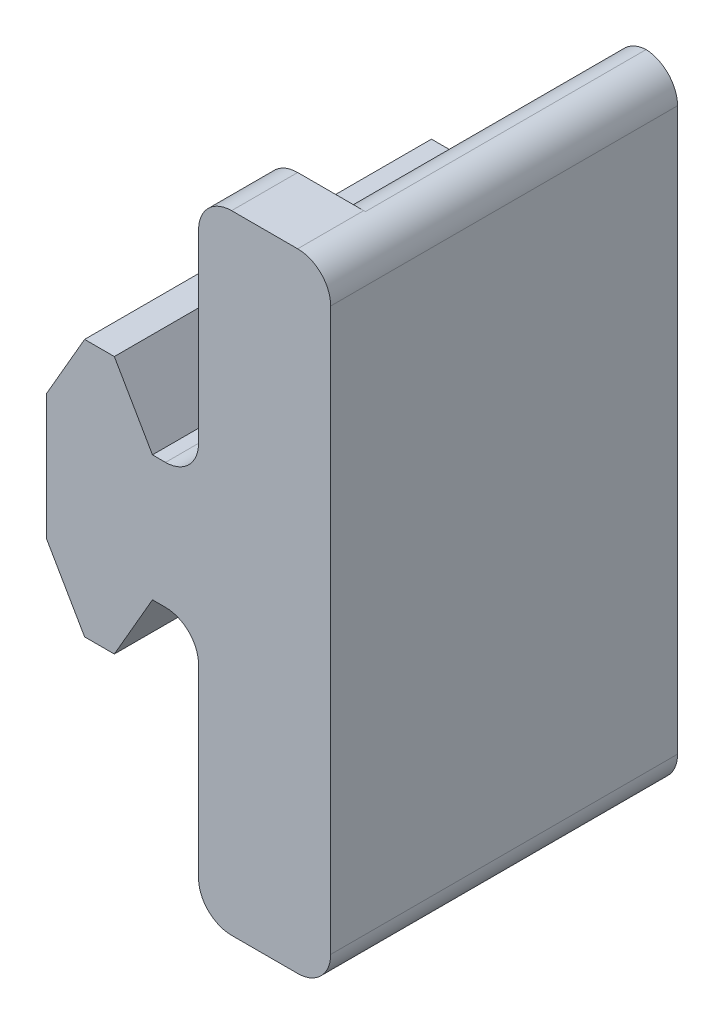
ISO-10303-21;
HEADER;
FILE_DESCRIPTION(('STEP AP214'),'2;1');
FILE_NAME('part.step','',(''),(''),'','','');
FILE_SCHEMA(('AUTOMOTIVE_DESIGN { 1 0 10303 214 1 1 1 1 }'));
ENDSEC;
DATA;
#1=APPLICATION_CONTEXT('core data for automotive mechanical design processes');
#2=APPLICATION_PROTOCOL_DEFINITION('international standard','automotive_design',2000,#1);
#3=PRODUCT_CONTEXT('',#1,'mechanical');
#4=PRODUCT('Part','Part','',(#3));
#5=PRODUCT_RELATED_PRODUCT_CATEGORY('part','',(#4));
#6=PRODUCT_DEFINITION_FORMATION('','',#4);
#7=PRODUCT_DEFINITION_CONTEXT('part definition',#1,'design');
#8=PRODUCT_DEFINITION('design','',#6,#7);
#9=PRODUCT_DEFINITION_SHAPE('','',#8);
#10=(LENGTH_UNIT() NAMED_UNIT(*) SI_UNIT(.MILLI.,.METRE.));
#11=(NAMED_UNIT(*) PLANE_ANGLE_UNIT() SI_UNIT($,.RADIAN.));
#12=(NAMED_UNIT(*) SI_UNIT($,.STERADIAN.) SOLID_ANGLE_UNIT());
#13=UNCERTAINTY_MEASURE_WITH_UNIT(LENGTH_MEASURE(1.E-05),#10,'distance_accuracy_value','');
#14=(GEOMETRIC_REPRESENTATION_CONTEXT(3) GLOBAL_UNCERTAINTY_ASSIGNED_CONTEXT((#13)) GLOBAL_UNIT_ASSIGNED_CONTEXT((#10,
#11,#12)) REPRESENTATION_CONTEXT('',''));
#15=CARTESIAN_POINT('',(0.,0.,0.));
#16=DIRECTION('',(0.,0.,1.));
#17=DIRECTION('',(1.,0.,0.));
#18=AXIS2_PLACEMENT_3D('',#15,#16,#17);
#19=CARTESIAN_POINT('',(0.,-3.8,21.));
#20=DIRECTION('',(1.,0.,0.));
#21=DIRECTION('',(0.,0.,-1.));
#22=AXIS2_PLACEMENT_3D('',#19,#20,#21);
#23=PLANE('',#22);
#24=DIRECTION('',(0.,-1.,0.));
#25=VECTOR('',#24,1.);
#26=CARTESIAN_POINT('',(0.,-3.8,21.));
#27=LINE('',#26,#25);
#28=CARTESIAN_POINT('',(0.,-5.8,21.));
#29=VERTEX_POINT('',#28);
#30=CARTESIAN_POINT('',(0.,-17.,21.));
#31=VERTEX_POINT('',#30);
#32=EDGE_CURVE('E393',#29,#31,#27,.T.);
#33=ORIENTED_EDGE('',*,*,#32,.F.);
#34=DIRECTION('',(0.,0.,-1.));
#35=VECTOR('',#34,1.);
#36=CARTESIAN_POINT('',(0.,-5.8,17.));
#37=LINE('',#36,#35);
#38=CARTESIAN_POINT('',(0.,-5.8,17.));
#39=VERTEX_POINT('',#38);
#40=EDGE_CURVE('E314',#29,#39,#37,.T.);
#41=ORIENTED_EDGE('',*,*,#40,.T.);
#42=DIRECTION('',(0.,1.,0.));
#43=VECTOR('',#42,1.);
#44=CARTESIAN_POINT('',(0.,-19.,17.));
#45=LINE('',#44,#43);
#46=CARTESIAN_POINT('',(0.,-17.,17.));
#47=VERTEX_POINT('',#46);
#48=EDGE_CURVE('E457',#47,#39,#45,.T.);
#49=ORIENTED_EDGE('',*,*,#48,.F.);
#50=DIRECTION('',(0.,0.,-1.));
#51=VECTOR('',#50,1.);
#52=CARTESIAN_POINT('',(0.,-17.,21.));
#53=LINE('',#52,#51);
#54=EDGE_CURVE('E312',#47,#31,#53,.F.);
#55=ORIENTED_EDGE('',*,*,#54,.T.);
#56=EDGE_LOOP('',(#33,#41,#49,#55));
#57=FACE_BOUND('',#56,.T.);
#58=ADVANCED_FACE('F39',(#57),#23,.F.);
#59=CARTESIAN_POINT('',(0.,3.8,21.));
#60=DIRECTION('',(1.,0.,0.));
#61=DIRECTION('',(0.,0.,-1.));
#62=AXIS2_PLACEMENT_3D('',#59,#60,#61);
#63=PLANE('',#62);
#64=CARTESIAN_POINT('',(0.,5.8,17.));
#65=VERTEX_POINT('',#64);
#66=CARTESIAN_POINT('',(0.,17.,17.));
#67=VERTEX_POINT('',#66);
#68=EDGE_CURVE('E353',#65,#67,#45,.T.);
#69=ORIENTED_EDGE('',*,*,#68,.F.);
#70=DIRECTION('',(0.,0.,-1.));
#71=VECTOR('',#70,1.);
#72=CARTESIAN_POINT('',(0.,5.8,21.));
#73=LINE('',#72,#71);
#74=CARTESIAN_POINT('',(0.,5.8,21.));
#75=VERTEX_POINT('',#74);
#76=EDGE_CURVE('E328',#65,#75,#73,.F.);
#77=ORIENTED_EDGE('',*,*,#76,.T.);
#78=DIRECTION('',(0.,-1.,0.));
#79=VECTOR('',#78,1.);
#80=CARTESIAN_POINT('',(0.,3.8,21.));
#81=LINE('',#80,#79);
#82=CARTESIAN_POINT('',(0.,17.,21.));
#83=VERTEX_POINT('',#82);
#84=EDGE_CURVE('E405',#83,#75,#81,.T.);
#85=ORIENTED_EDGE('',*,*,#84,.F.);
#86=DIRECTION('',(0.,0.,-1.));
#87=VECTOR('',#86,1.);
#88=CARTESIAN_POINT('',(0.,17.,21.));
#89=LINE('',#88,#87);
#90=EDGE_CURVE('E325',#83,#67,#89,.T.);
#91=ORIENTED_EDGE('',*,*,#90,.T.);
#92=EDGE_LOOP('',(#69,#77,#85,#91));
#93=FACE_BOUND('',#92,.T.);
#94=ADVANCED_FACE('F475',(#93),#63,.F.);
#95=CARTESIAN_POINT('',(0.,0.,0.));
#96=DIRECTION('',(0.,0.,-1.));
#97=DIRECTION('',(-1.,0.,0.));
#98=AXIS2_PLACEMENT_3D('',#95,#96,#97);
#99=PLANE('',#98);
#100=DIRECTION('',(0.,1.,0.));
#101=VECTOR('',#100,1.);
#102=CARTESIAN_POINT('',(0.,0.,0.));
#103=LINE('',#102,#101);
#104=CARTESIAN_POINT('',(0.,-3.8,0.));
#105=VERTEX_POINT('',#104);
#106=CARTESIAN_POINT('',(0.,3.8,0.));
#107=VERTEX_POINT('',#106);
#108=EDGE_CURVE('E217',#105,#107,#103,.T.);
#109=ORIENTED_EDGE('',*,*,#108,.F.);
#110=DIRECTION('',(1.,0.,0.));
#111=VECTOR('',#110,1.);
#112=CARTESIAN_POINT('',(-2.79059892324151,-3.8,0.));
#113=LINE('',#112,#111);
#114=CARTESIAN_POINT('',(-2.79059892324151,-3.8,0.));
#115=VERTEX_POINT('',#114);
#116=EDGE_CURVE('E230',#115,#105,#113,.T.);
#117=ORIENTED_EDGE('',*,*,#116,.F.);
#118=DIRECTION('',(0.499999999999998,0.86602540378444,0.));
#119=VECTOR('',#118,1.);
#120=CARTESIAN_POINT('',(-5.1,-7.8,0.));
#121=LINE('',#120,#119);
#122=CARTESIAN_POINT('',(-5.1,-7.8,0.));
#123=VERTEX_POINT('',#122);
#124=EDGE_CURVE('E242',#123,#115,#121,.T.);
#125=ORIENTED_EDGE('',*,*,#124,.F.);
#126=DIRECTION('',(1.,0.,0.));
#127=VECTOR('',#126,1.);
#128=CARTESIAN_POINT('',(-6.9,-7.8,0.));
#129=LINE('',#128,#127);
#130=CARTESIAN_POINT('',(-6.9,-7.8,0.));
#131=VERTEX_POINT('',#130);
#132=EDGE_CURVE('E246',#131,#123,#129,.T.);
#133=ORIENTED_EDGE('',*,*,#132,.F.);
#134=DIRECTION('',(0.499999999999998,-0.86602540378444,0.));
#135=VECTOR('',#134,1.);
#136=CARTESIAN_POINT('',(-9.20940107675849,-3.8,0.));
#137=LINE('',#136,#135);
#138=CARTESIAN_POINT('',(-9.20940107675849,-3.8,0.));
#139=VERTEX_POINT('',#138);
#140=EDGE_CURVE('E417',#139,#131,#137,.T.);
#141=ORIENTED_EDGE('',*,*,#140,.F.);
#142=DIRECTION('',(0.,-1.,0.));
#143=VECTOR('',#142,1.);
#144=CARTESIAN_POINT('',(-9.20940107675849,-3.8,0.));
#145=LINE('',#144,#143);
#146=CARTESIAN_POINT('',(-9.20940107675849,3.8,0.));
#147=VERTEX_POINT('',#146);
#148=EDGE_CURVE('E415',#147,#139,#145,.T.);
#149=ORIENTED_EDGE('',*,*,#148,.F.);
#150=DIRECTION('',(-0.499999999999998,-0.86602540378444,0.));
#151=VECTOR('',#150,1.);
#152=CARTESIAN_POINT('',(-9.20940107675849,3.8,0.));
#153=LINE('',#152,#151);
#154=CARTESIAN_POINT('',(-6.9,7.8,0.));
#155=VERTEX_POINT('',#154);
#156=EDGE_CURVE('E222',#155,#147,#153,.T.);
#157=ORIENTED_EDGE('',*,*,#156,.F.);
#158=DIRECTION('',(-1.,0.,0.));
#159=VECTOR('',#158,1.);
#160=CARTESIAN_POINT('',(-6.9,7.8,0.));
#161=LINE('',#160,#159);
#162=CARTESIAN_POINT('',(-5.1,7.8,0.));
#163=VERTEX_POINT('',#162);
#164=EDGE_CURVE('E253',#163,#155,#161,.T.);
#165=ORIENTED_EDGE('',*,*,#164,.F.);
#166=DIRECTION('',(-0.499999999999998,0.86602540378444,0.));
#167=VECTOR('',#166,1.);
#168=CARTESIAN_POINT('',(-5.1,7.8,0.));
#169=LINE('',#168,#167);
#170=CARTESIAN_POINT('',(-2.79059892324151,3.8,0.));
#171=VERTEX_POINT('',#170);
#172=EDGE_CURVE('E251',#171,#163,#169,.T.);
#173=ORIENTED_EDGE('',*,*,#172,.F.);
#174=DIRECTION('',(-1.,0.,0.));
#175=VECTOR('',#174,1.);
#176=CARTESIAN_POINT('',(-2.79059892324151,3.8,0.));
#177=LINE('',#176,#175);
#178=EDGE_CURVE('E232',#107,#171,#177,.T.);
#179=ORIENTED_EDGE('',*,*,#178,.F.);
#180=EDGE_LOOP('',(#109,#117,#125,#133,#141,#149,#157,#165,#173,#179));
#181=FACE_BOUND('',#180,.T.);
#182=ADVANCED_FACE('F228',(#181),#99,.T.);
#183=CARTESIAN_POINT('',(-9.20940107675849,3.8,21.));
#184=DIRECTION('',(0.86602540378444,-0.499999999999998,0.));
#185=DIRECTION('',(0.499999999999998,0.86602540378444,0.));
#186=AXIS2_PLACEMENT_3D('',#183,#184,#185);
#187=PLANE('',#186);
#188=ORIENTED_EDGE('',*,*,#156,.T.);
#189=DIRECTION('',(0.,0.,-1.));
#190=VECTOR('',#189,1.);
#191=CARTESIAN_POINT('',(-9.20940107675849,3.8,21.));
#192=LINE('',#191,#190);
#193=CARTESIAN_POINT('',(-9.20940107675849,3.8,21.));
#194=VERTEX_POINT('',#193);
#195=EDGE_CURVE('E234',#194,#147,#192,.T.);
#196=ORIENTED_EDGE('',*,*,#195,.F.);
#197=DIRECTION('',(-0.499999999999998,-0.86602540378444,0.));
#198=VECTOR('',#197,1.);
#199=CARTESIAN_POINT('',(-9.20940107675849,3.8,21.));
#200=LINE('',#199,#198);
#201=CARTESIAN_POINT('',(-6.9,7.8,21.));
#202=VERTEX_POINT('',#201);
#203=EDGE_CURVE('E255',#202,#194,#200,.T.);
#204=ORIENTED_EDGE('',*,*,#203,.F.);
#205=DIRECTION('',(0.,0.,-1.));
#206=VECTOR('',#205,1.);
#207=CARTESIAN_POINT('',(-6.9,7.8,21.));
#208=LINE('',#207,#206);
#209=EDGE_CURVE('E256',#202,#155,#208,.T.);
#210=ORIENTED_EDGE('',*,*,#209,.T.);
#211=EDGE_LOOP('',(#188,#196,#204,#210));
#212=FACE_BOUND('',#211,.T.);
#213=ADVANCED_FACE('F442',(#212),#187,.F.);
#214=CARTESIAN_POINT('',(-9.20940107675849,-3.8,21.));
#215=DIRECTION('',(1.,0.,0.));
#216=DIRECTION('',(0.,0.,-1.));
#217=AXIS2_PLACEMENT_3D('',#214,#215,#216);
#218=PLANE('',#217);
#219=ORIENTED_EDGE('',*,*,#148,.T.);
#220=DIRECTION('',(0.,0.,-1.));
#221=VECTOR('',#220,1.);
#222=CARTESIAN_POINT('',(-9.20940107675849,-3.8,21.));
#223=LINE('',#222,#221);
#224=CARTESIAN_POINT('',(-9.20940107675849,-3.8,21.));
#225=VERTEX_POINT('',#224);
#226=EDGE_CURVE('E273',#225,#139,#223,.T.);
#227=ORIENTED_EDGE('',*,*,#226,.F.);
#228=DIRECTION('',(0.,-1.,0.));
#229=VECTOR('',#228,1.);
#230=CARTESIAN_POINT('',(-9.20940107675849,-3.8,21.));
#231=LINE('',#230,#229);
#232=EDGE_CURVE('E382',#194,#225,#231,.T.);
#233=ORIENTED_EDGE('',*,*,#232,.F.);
#234=ORIENTED_EDGE('',*,*,#195,.T.);
#235=EDGE_LOOP('',(#219,#227,#233,#234));
#236=FACE_BOUND('',#235,.T.);
#237=ADVANCED_FACE('F439',(#236),#218,.F.);
#238=CARTESIAN_POINT('',(-9.20940107675849,-3.8,21.));
#239=DIRECTION('',(0.86602540378444,0.499999999999998,0.));
#240=DIRECTION('',(-0.499999999999998,0.86602540378444,0.));
#241=AXIS2_PLACEMENT_3D('',#238,#239,#240);
#242=PLANE('',#241);
#243=ORIENTED_EDGE('',*,*,#140,.T.);
#244=DIRECTION('',(0.,0.,-1.));
#245=VECTOR('',#244,1.);
#246=CARTESIAN_POINT('',(-6.9,-7.8,21.));
#247=LINE('',#246,#245);
#248=CARTESIAN_POINT('',(-6.9,-7.8,21.));
#249=VERTEX_POINT('',#248);
#250=EDGE_CURVE('E270',#249,#131,#247,.T.);
#251=ORIENTED_EDGE('',*,*,#250,.F.);
#252=DIRECTION('',(0.499999999999998,-0.86602540378444,0.));
#253=VECTOR('',#252,1.);
#254=CARTESIAN_POINT('',(-9.20940107675849,-3.8,21.));
#255=LINE('',#254,#253);
#256=EDGE_CURVE('E384',#225,#249,#255,.T.);
#257=ORIENTED_EDGE('',*,*,#256,.F.);
#258=ORIENTED_EDGE('',*,*,#226,.T.);
#259=EDGE_LOOP('',(#243,#251,#257,#258));
#260=FACE_BOUND('',#259,.T.);
#261=ADVANCED_FACE('F434',(#260),#242,.F.);
#262=CARTESIAN_POINT('',(-6.9,-7.8,21.));
#263=DIRECTION('',(0.,1.,0.));
#264=DIRECTION('',(0.,0.,1.));
#265=AXIS2_PLACEMENT_3D('',#262,#263,#264);
#266=PLANE('',#265);
#267=ORIENTED_EDGE('',*,*,#132,.T.);
#268=DIRECTION('',(0.,0.,-1.));
#269=VECTOR('',#268,1.);
#270=CARTESIAN_POINT('',(-5.1,-7.8,21.));
#271=LINE('',#270,#269);
#272=CARTESIAN_POINT('',(-5.1,-7.8,21.));
#273=VERTEX_POINT('',#272);
#274=EDGE_CURVE('E267',#273,#123,#271,.T.);
#275=ORIENTED_EDGE('',*,*,#274,.F.);
#276=DIRECTION('',(1.,0.,0.));
#277=VECTOR('',#276,1.);
#278=CARTESIAN_POINT('',(-6.9,-7.8,21.));
#279=LINE('',#278,#277);
#280=EDGE_CURVE('E386',#249,#273,#279,.T.);
#281=ORIENTED_EDGE('',*,*,#280,.F.);
#282=ORIENTED_EDGE('',*,*,#250,.T.);
#283=EDGE_LOOP('',(#267,#275,#281,#282));
#284=FACE_BOUND('',#283,.T.);
#285=ADVANCED_FACE('F421',(#284),#266,.F.);
#286=CARTESIAN_POINT('',(-5.1,-7.8,21.));
#287=DIRECTION('',(-0.86602540378444,0.499999999999998,0.));
#288=DIRECTION('',(-0.499999999999998,-0.86602540378444,0.));
#289=AXIS2_PLACEMENT_3D('',#286,#287,#288);
#290=PLANE('',#289);
#291=ORIENTED_EDGE('',*,*,#124,.T.);
#292=DIRECTION('',(0.,0.,-1.));
#293=VECTOR('',#292,1.);
#294=CARTESIAN_POINT('',(-2.79059892324151,-3.8,21.));
#295=LINE('',#294,#293);
#296=CARTESIAN_POINT('',(-2.79059892324151,-3.8,21.));
#297=VERTEX_POINT('',#296);
#298=EDGE_CURVE('E240',#297,#115,#295,.T.);
#299=ORIENTED_EDGE('',*,*,#298,.F.);
#300=DIRECTION('',(0.499999999999998,0.86602540378444,0.));
#301=VECTOR('',#300,1.);
#302=CARTESIAN_POINT('',(-5.1,-7.8,21.));
#303=LINE('',#302,#301);
#304=EDGE_CURVE('E388',#273,#297,#303,.T.);
#305=ORIENTED_EDGE('',*,*,#304,.F.);
#306=ORIENTED_EDGE('',*,*,#274,.T.);
#307=EDGE_LOOP('',(#291,#299,#305,#306));
#308=FACE_BOUND('',#307,.T.);
#309=ADVANCED_FACE('F427',(#308),#290,.F.);
#310=CARTESIAN_POINT('',(-2.79059892324151,-3.8,21.));
#311=DIRECTION('',(0.,1.,0.));
#312=DIRECTION('',(-1.,0.,0.));
#313=AXIS2_PLACEMENT_3D('',#310,#311,#312);
#314=PLANE('',#313);
#315=DIRECTION('',(0.,0.,1.));
#316=VECTOR('',#315,1.);
#317=CARTESIAN_POINT('',(0.,-3.8,21.));
#318=LINE('',#317,#316);
#319=CARTESIAN_POINT('',(0.,-3.8,17.));
#320=VERTEX_POINT('',#319);
#321=EDGE_CURVE('E213',#105,#320,#318,.T.);
#322=ORIENTED_EDGE('',*,*,#321,.T.);
#323=DIRECTION('',(-1.,0.,0.));
#324=VECTOR('',#323,1.);
#325=CARTESIAN_POINT('',(-2.79059892324151,-3.8,17.));
#326=LINE('',#325,#324);
#327=CARTESIAN_POINT('',(-2.,-3.8,17.));
#328=VERTEX_POINT('',#327);
#329=EDGE_CURVE('E56',#320,#328,#326,.T.);
#330=ORIENTED_EDGE('',*,*,#329,.T.);
#331=DIRECTION('',(0.,0.,-1.));
#332=VECTOR('',#331,1.);
#333=CARTESIAN_POINT('',(-2.,-3.8,21.));
#334=LINE('',#333,#332);
#335=CARTESIAN_POINT('',(-2.,-3.8,21.));
#336=VERTEX_POINT('',#335);
#337=EDGE_CURVE('E317',#328,#336,#334,.F.);
#338=ORIENTED_EDGE('',*,*,#337,.T.);
#339=DIRECTION('',(1.,0.,0.));
#340=VECTOR('',#339,1.);
#341=CARTESIAN_POINT('',(-2.79059892324151,-3.8,21.));
#342=LINE('',#341,#340);
#343=EDGE_CURVE('E390',#297,#336,#342,.T.);
#344=ORIENTED_EDGE('',*,*,#343,.F.);
#345=ORIENTED_EDGE('',*,*,#298,.T.);
#346=ORIENTED_EDGE('',*,*,#116,.T.);
#347=EDGE_LOOP('',(#322,#330,#338,#344,#345,#346));
#348=FACE_BOUND('',#347,.T.);
#349=ADVANCED_FACE('F237',(#348),#314,.F.);
#350=CARTESIAN_POINT('',(0.,-19.,21.));
#351=DIRECTION('',(0.,1.,0.));
#352=DIRECTION('',(0.,0.,1.));
#353=AXIS2_PLACEMENT_3D('',#350,#351,#352);
#354=PLANE('',#353);
#355=DIRECTION('',(-1.,0.,0.));
#356=VECTOR('',#355,1.);
#357=CARTESIAN_POINT('',(0.,-19.,17.));
#358=LINE('',#357,#356);
#359=CARTESIAN_POINT('',(6.,-19.,17.));
#360=VERTEX_POINT('',#359);
#361=CARTESIAN_POINT('',(2.,-19.,17.));
#362=VERTEX_POINT('',#361);
#363=EDGE_CURVE('E369',#360,#362,#358,.T.);
#364=ORIENTED_EDGE('',*,*,#363,.F.);
#365=DIRECTION('',(0.,0.,-1.));
#366=VECTOR('',#365,1.);
#367=CARTESIAN_POINT('',(6.,-19.,21.));
#368=LINE('',#367,#366);
#369=CARTESIAN_POINT('',(6.,-19.,21.));
#370=VERTEX_POINT('',#369);
#371=EDGE_CURVE('E310',#360,#370,#368,.F.);
#372=ORIENTED_EDGE('',*,*,#371,.T.);
#373=DIRECTION('',(1.,0.,0.));
#374=VECTOR('',#373,1.);
#375=CARTESIAN_POINT('',(0.,-19.,21.));
#376=LINE('',#375,#374);
#377=CARTESIAN_POINT('',(2.,-19.,21.));
#378=VERTEX_POINT('',#377);
#379=EDGE_CURVE('E396',#378,#370,#376,.T.);
#380=ORIENTED_EDGE('',*,*,#379,.F.);
#381=DIRECTION('',(0.,0.,-1.));
#382=VECTOR('',#381,1.);
#383=CARTESIAN_POINT('',(2.,-19.,21.));
#384=LINE('',#383,#382);
#385=EDGE_CURVE('E307',#378,#362,#384,.T.);
#386=ORIENTED_EDGE('',*,*,#385,.T.);
#387=EDGE_LOOP('',(#364,#372,#380,#386));
#388=FACE_BOUND('',#387,.T.);
#389=ADVANCED_FACE('F502',(#388),#354,.F.);
#390=CARTESIAN_POINT('',(8.,19.,21.));
#391=DIRECTION('',(-1.,0.,0.));
#392=DIRECTION('',(0.,0.,1.));
#393=AXIS2_PLACEMENT_3D('',#390,#391,#392);
#394=PLANE('',#393);
#395=DIRECTION('',(0.,1.,0.));
#396=VECTOR('',#395,1.);
#397=CARTESIAN_POINT('',(8.,19.,0.));
#398=LINE('',#397,#396);
#399=CARTESIAN_POINT('',(8.,-17.,0.));
#400=VERTEX_POINT('',#399);
#401=CARTESIAN_POINT('',(8.,17.,0.));
#402=VERTEX_POINT('',#401);
#403=EDGE_CURVE('E241',#400,#402,#398,.T.);
#404=ORIENTED_EDGE('',*,*,#403,.T.);
#405=DIRECTION('',(0.,0.,-1.));
#406=VECTOR('',#405,1.);
#407=CARTESIAN_POINT('',(8.,17.,21.));
#408=LINE('',#407,#406);
#409=CARTESIAN_POINT('',(8.,17.,21.));
#410=VERTEX_POINT('',#409);
#411=EDGE_CURVE('E292',#402,#410,#408,.F.);
#412=ORIENTED_EDGE('',*,*,#411,.T.);
#413=DIRECTION('',(0.,1.,0.));
#414=VECTOR('',#413,1.);
#415=CARTESIAN_POINT('',(8.,19.,21.));
#416=LINE('',#415,#414);
#417=CARTESIAN_POINT('',(8.,-17.,21.));
#418=VERTEX_POINT('',#417);
#419=EDGE_CURVE('E399',#418,#410,#416,.T.);
#420=ORIENTED_EDGE('',*,*,#419,.F.);
#421=DIRECTION('',(0.,0.,-1.));
#422=VECTOR('',#421,1.);
#423=CARTESIAN_POINT('',(8.,-17.,21.));
#424=LINE('',#423,#422);
#425=EDGE_CURVE('E290',#418,#400,#424,.T.);
#426=ORIENTED_EDGE('',*,*,#425,.T.);
#427=EDGE_LOOP('',(#404,#412,#420,#426));
#428=FACE_BOUND('',#427,.T.);
#429=ADVANCED_FACE('F652',(#428),#394,.F.);
#430=CARTESIAN_POINT('',(0.,19.,21.));
#431=DIRECTION('',(0.,-1.,0.));
#432=DIRECTION('',(0.,0.,-1.));
#433=AXIS2_PLACEMENT_3D('',#430,#431,#432);
#434=PLANE('',#433);
#435=DIRECTION('',(-1.,0.,0.));
#436=VECTOR('',#435,1.);
#437=CARTESIAN_POINT('',(0.,19.,21.));
#438=LINE('',#437,#436);
#439=CARTESIAN_POINT('',(6.,19.,21.));
#440=VERTEX_POINT('',#439);
#441=CARTESIAN_POINT('',(2.,19.,21.));
#442=VERTEX_POINT('',#441);
#443=EDGE_CURVE('E402',#440,#442,#438,.T.);
#444=ORIENTED_EDGE('',*,*,#443,.F.);
#445=DIRECTION('',(0.,0.,-1.));
#446=VECTOR('',#445,1.);
#447=CARTESIAN_POINT('',(6.,19.,21.));
#448=LINE('',#447,#446);
#449=CARTESIAN_POINT('',(6.,19.,17.));
#450=VERTEX_POINT('',#449);
#451=EDGE_CURVE('E279',#440,#450,#448,.T.);
#452=ORIENTED_EDGE('',*,*,#451,.T.);
#453=DIRECTION('',(1.,0.,0.));
#454=VECTOR('',#453,1.);
#455=CARTESIAN_POINT('',(0.,19.,17.));
#456=LINE('',#455,#454);
#457=CARTESIAN_POINT('',(2.,19.,17.));
#458=VERTEX_POINT('',#457);
#459=EDGE_CURVE('E376',#458,#450,#456,.T.);
#460=ORIENTED_EDGE('',*,*,#459,.F.);
#461=DIRECTION('',(0.,0.,-1.));
#462=VECTOR('',#461,1.);
#463=CARTESIAN_POINT('',(2.,19.,21.));
#464=LINE('',#463,#462);
#465=EDGE_CURVE('E233',#458,#442,#464,.F.);
#466=ORIENTED_EDGE('',*,*,#465,.T.);
#467=EDGE_LOOP('',(#444,#452,#460,#466));
#468=FACE_BOUND('',#467,.T.);
#469=ADVANCED_FACE('F468',(#468),#434,.F.);
#470=CARTESIAN_POINT('',(-2.79059892324151,3.8,21.));
#471=DIRECTION('',(0.,-1.,0.));
#472=DIRECTION('',(1.,0.,0.));
#473=AXIS2_PLACEMENT_3D('',#470,#471,#472);
#474=PLANE('',#473);
#475=DIRECTION('',(-1.,0.,0.));
#476=VECTOR('',#475,1.);
#477=CARTESIAN_POINT('',(-2.79059892324151,3.8,21.));
#478=LINE('',#477,#476);
#479=CARTESIAN_POINT('',(-2.,3.8,21.));
#480=VERTEX_POINT('',#479);
#481=CARTESIAN_POINT('',(-2.79059892324151,3.8,21.));
#482=VERTEX_POINT('',#481);
#483=EDGE_CURVE('E408',#480,#482,#478,.T.);
#484=ORIENTED_EDGE('',*,*,#483,.F.);
#485=DIRECTION('',(0.,0.,-1.));
#486=VECTOR('',#485,1.);
#487=CARTESIAN_POINT('',(-2.,3.8,17.));
#488=LINE('',#487,#486);
#489=CARTESIAN_POINT('',(-2.,3.8,17.));
#490=VERTEX_POINT('',#489);
#491=EDGE_CURVE('E322',#480,#490,#488,.T.);
#492=ORIENTED_EDGE('',*,*,#491,.T.);
#493=DIRECTION('',(1.,0.,0.));
#494=VECTOR('',#493,1.);
#495=CARTESIAN_POINT('',(-2.79059892324151,3.8,17.));
#496=LINE('',#495,#494);
#497=CARTESIAN_POINT('',(0.,3.8,17.));
#498=VERTEX_POINT('',#497);
#499=EDGE_CURVE('E320',#490,#498,#496,.T.);
#500=ORIENTED_EDGE('',*,*,#499,.T.);
#501=DIRECTION('',(0.,0.,-1.));
#502=VECTOR('',#501,1.);
#503=CARTESIAN_POINT('',(0.,3.8,21.));
#504=LINE('',#503,#502);
#505=EDGE_CURVE('E223',#498,#107,#504,.T.);
#506=ORIENTED_EDGE('',*,*,#505,.T.);
#507=ORIENTED_EDGE('',*,*,#178,.T.);
#508=DIRECTION('',(0.,0.,-1.));
#509=VECTOR('',#508,1.);
#510=CARTESIAN_POINT('',(-2.79059892324151,3.8,21.));
#511=LINE('',#510,#509);
#512=EDGE_CURVE('E263',#482,#171,#511,.T.);
#513=ORIENTED_EDGE('',*,*,#512,.F.);
#514=EDGE_LOOP('',(#484,#492,#500,#506,#507,#513));
#515=FACE_BOUND('',#514,.T.);
#516=ADVANCED_FACE('F454',(#515),#474,.F.);
#517=CARTESIAN_POINT('',(-5.1,7.8,21.));
#518=DIRECTION('',(-0.86602540378444,-0.499999999999998,0.));
#519=DIRECTION('',(0.499999999999998,-0.86602540378444,0.));
#520=AXIS2_PLACEMENT_3D('',#517,#518,#519);
#521=PLANE('',#520);
#522=ORIENTED_EDGE('',*,*,#172,.T.);
#523=DIRECTION('',(0.,0.,-1.));
#524=VECTOR('',#523,1.);
#525=CARTESIAN_POINT('',(-5.1,7.8,21.));
#526=LINE('',#525,#524);
#527=CARTESIAN_POINT('',(-5.1,7.8,21.));
#528=VERTEX_POINT('',#527);
#529=EDGE_CURVE('E259',#528,#163,#526,.T.);
#530=ORIENTED_EDGE('',*,*,#529,.F.);
#531=DIRECTION('',(-0.499999999999998,0.86602540378444,0.));
#532=VECTOR('',#531,1.);
#533=CARTESIAN_POINT('',(-5.1,7.8,21.));
#534=LINE('',#533,#532);
#535=EDGE_CURVE('E410',#482,#528,#534,.T.);
#536=ORIENTED_EDGE('',*,*,#535,.F.);
#537=ORIENTED_EDGE('',*,*,#512,.T.);
#538=EDGE_LOOP('',(#522,#530,#536,#537));
#539=FACE_BOUND('',#538,.T.);
#540=ADVANCED_FACE('F449',(#539),#521,.F.);
#541=CARTESIAN_POINT('',(-6.9,7.8,21.));
#542=DIRECTION('',(0.,-1.,0.));
#543=DIRECTION('',(0.,0.,-1.));
#544=AXIS2_PLACEMENT_3D('',#541,#542,#543);
#545=PLANE('',#544);
#546=ORIENTED_EDGE('',*,*,#164,.T.);
#547=ORIENTED_EDGE('',*,*,#209,.F.);
#548=DIRECTION('',(-1.,0.,0.));
#549=VECTOR('',#548,1.);
#550=CARTESIAN_POINT('',(-6.9,7.8,21.));
#551=LINE('',#550,#549);
#552=EDGE_CURVE('E260',#528,#202,#551,.T.);
#553=ORIENTED_EDGE('',*,*,#552,.F.);
#554=ORIENTED_EDGE('',*,*,#529,.T.);
#555=EDGE_LOOP('',(#546,#547,#553,#554));
#556=FACE_BOUND('',#555,.T.);
#557=ADVANCED_FACE('F446',(#556),#545,.F.);
#558=CARTESIAN_POINT('',(0.,0.,21.));
#559=DIRECTION('',(0.,0.,-1.));
#560=DIRECTION('',(-1.,0.,0.));
#561=AXIS2_PLACEMENT_3D('',#558,#559,#560);
#562=PLANE('',#561);
#563=ORIENTED_EDGE('',*,*,#419,.T.);
#564=CARTESIAN_POINT('',(6.,17.,21.));
#565=DIRECTION('',(0.,0.,-1.));
#566=DIRECTION('',(-1.,0.,0.));
#567=AXIS2_PLACEMENT_3D('',#564,#565,#566);
#568=CIRCLE('',#567,2.);
#569=EDGE_CURVE('E300',#410,#440,#568,.F.);
#570=ORIENTED_EDGE('',*,*,#569,.T.);
#571=ORIENTED_EDGE('',*,*,#443,.T.);
#572=CARTESIAN_POINT('',(2.,17.,21.));
#573=DIRECTION('',(0.,0.,-1.));
#574=DIRECTION('',(-1.,0.,0.));
#575=AXIS2_PLACEMENT_3D('',#572,#573,#574);
#576=CIRCLE('',#575,2.);
#577=EDGE_CURVE('E294',#442,#83,#576,.F.);
#578=ORIENTED_EDGE('',*,*,#577,.T.);
#579=ORIENTED_EDGE('',*,*,#84,.T.);
#580=CARTESIAN_POINT('',(-2.,5.8,21.));
#581=DIRECTION('',(0.,0.,-1.));
#582=DIRECTION('',(-1.,0.,0.));
#583=AXIS2_PLACEMENT_3D('',#580,#581,#582);
#584=CIRCLE('',#583,2.);
#585=EDGE_CURVE('E48',#75,#480,#584,.T.);
#586=ORIENTED_EDGE('',*,*,#585,.T.);
#587=ORIENTED_EDGE('',*,*,#483,.T.);
#588=ORIENTED_EDGE('',*,*,#535,.T.);
#589=ORIENTED_EDGE('',*,*,#552,.T.);
#590=ORIENTED_EDGE('',*,*,#203,.T.);
#591=ORIENTED_EDGE('',*,*,#232,.T.);
#592=ORIENTED_EDGE('',*,*,#256,.T.);
#593=ORIENTED_EDGE('',*,*,#280,.T.);
#594=ORIENTED_EDGE('',*,*,#304,.T.);
#595=ORIENTED_EDGE('',*,*,#343,.T.);
#596=CARTESIAN_POINT('',(-2.,-5.8,21.));
#597=DIRECTION('',(0.,0.,-1.));
#598=DIRECTION('',(-1.,0.,0.));
#599=AXIS2_PLACEMENT_3D('',#596,#597,#598);
#600=CIRCLE('',#599,2.);
#601=EDGE_CURVE('E341',#336,#29,#600,.T.);
#602=ORIENTED_EDGE('',*,*,#601,.T.);
#603=ORIENTED_EDGE('',*,*,#32,.T.);
#604=CARTESIAN_POINT('',(2.,-17.,21.));
#605=DIRECTION('',(0.,0.,-1.));
#606=DIRECTION('',(-1.,0.,0.));
#607=AXIS2_PLACEMENT_3D('',#604,#605,#606);
#608=CIRCLE('',#607,2.);
#609=EDGE_CURVE('E296',#31,#378,#608,.F.);
#610=ORIENTED_EDGE('',*,*,#609,.T.);
#611=ORIENTED_EDGE('',*,*,#379,.T.);
#612=CARTESIAN_POINT('',(6.,-17.,21.));
#613=DIRECTION('',(0.,0.,-1.));
#614=DIRECTION('',(-1.,0.,0.));
#615=AXIS2_PLACEMENT_3D('',#612,#613,#614);
#616=CIRCLE('',#615,2.);
#617=EDGE_CURVE('E298',#370,#418,#616,.F.);
#618=ORIENTED_EDGE('',*,*,#617,.T.);
#619=EDGE_LOOP('',(#563,#570,#571,#578,#579,#586,#587,#588,#589,#590,#591,#592,#593,#594,#595,
#602,#603,#610,#611,#618));
#620=FACE_BOUND('',#619,.T.);
#621=ADVANCED_FACE('F429',(#620),#562,.F.);
#622=CARTESIAN_POINT('',(6.,-17.,0.));
#623=DIRECTION('',(0.,0.,-1.));
#624=DIRECTION('',(-1.,0.,0.));
#625=AXIS2_PLACEMENT_3D('',#622,#623,#624);
#626=CIRCLE('',#625,2.);
#627=CARTESIAN_POINT('',(6.09999999999997,-18.9974984355438,0.));
#628=VERTEX_POINT('',#627);
#629=EDGE_CURVE('E286',#400,#628,#626,.T.);
#630=ORIENTED_EDGE('',*,*,#629,.T.);
#631=CARTESIAN_POINT('',(6.2,-17.,0.));
#632=DIRECTION('',(0.,0.,-1.));
#633=DIRECTION('',(-1.,0.,0.));
#634=AXIS2_PLACEMENT_3D('',#631,#632,#633);
#635=CIRCLE('',#634,2.);
#636=CARTESIAN_POINT('',(4.2,-17.,0.));
#637=VERTEX_POINT('',#636);
#638=EDGE_CURVE('E288',#628,#637,#635,.T.);
#639=ORIENTED_EDGE('',*,*,#638,.T.);
#640=DIRECTION('',(0.,-1.,0.));
#641=VECTOR('',#640,1.);
#642=CARTESIAN_POINT('',(4.2,-19.,0.));
#643=LINE('',#642,#641);
#644=CARTESIAN_POINT('',(4.2,17.,0.));
#645=VERTEX_POINT('',#644);
#646=EDGE_CURVE('E347',#645,#637,#643,.T.);
#647=ORIENTED_EDGE('',*,*,#646,.F.);
#648=CARTESIAN_POINT('',(6.2,17.,0.));
#649=DIRECTION('',(0.,0.,-1.));
#650=DIRECTION('',(-1.,0.,0.));
#651=AXIS2_PLACEMENT_3D('',#648,#649,#650);
#652=CIRCLE('',#651,2.);
#653=CARTESIAN_POINT('',(6.09999999999997,18.9974984355438,0.));
#654=VERTEX_POINT('',#653);
#655=EDGE_CURVE('E282',#645,#654,#652,.T.);
#656=ORIENTED_EDGE('',*,*,#655,.T.);
#657=CARTESIAN_POINT('',(6.,17.,0.));
#658=DIRECTION('',(0.,0.,-1.));
#659=DIRECTION('',(-1.,0.,0.));
#660=AXIS2_PLACEMENT_3D('',#657,#658,#659);
#661=CIRCLE('',#660,2.);
#662=EDGE_CURVE('E284',#654,#402,#661,.T.);
#663=ORIENTED_EDGE('',*,*,#662,.T.);
#664=ORIENTED_EDGE('',*,*,#403,.F.);
#665=EDGE_LOOP('',(#630,#639,#647,#656,#663,#664));
#666=FACE_BOUND('',#665,.T.);
#667=ADVANCED_FACE('F590',(#666),#99,.T.);
#668=CARTESIAN_POINT('',(0.,-19.,17.));
#669=DIRECTION('',(-1.,0.,0.));
#670=DIRECTION('',(0.,0.,1.));
#671=AXIS2_PLACEMENT_3D('',#668,#669,#670);
#672=PLANE('',#671);
#673=ORIENTED_EDGE('',*,*,#108,.T.);
#674=ORIENTED_EDGE('',*,*,#505,.F.);
#675=EDGE_CURVE('E219',#320,#498,#45,.T.);
#676=ORIENTED_EDGE('',*,*,#675,.F.);
#677=ORIENTED_EDGE('',*,*,#321,.F.);
#678=EDGE_LOOP('',(#673,#674,#676,#677));
#679=FACE_BOUND('',#678,.T.);
#680=ADVANCED_FACE('F215',(#679),#672,.F.);
#681=CARTESIAN_POINT('',(4.2,-19.,17.));
#682=DIRECTION('',(1.,0.,0.));
#683=DIRECTION('',(0.,1.,0.));
#684=AXIS2_PLACEMENT_3D('',#681,#682,#683);
#685=PLANE('',#684);
#686=ORIENTED_EDGE('',*,*,#646,.T.);
#687=DIRECTION('',(0.,0.,-1.));
#688=VECTOR('',#687,1.);
#689=CARTESIAN_POINT('',(4.2,-17.,17.));
#690=LINE('',#689,#688);
#691=CARTESIAN_POINT('',(4.2,-17.,17.));
#692=VERTEX_POINT('',#691);
#693=EDGE_CURVE('E304',#637,#692,#690,.F.);
#694=ORIENTED_EDGE('',*,*,#693,.T.);
#695=DIRECTION('',(0.,-1.,0.));
#696=VECTOR('',#695,1.);
#697=CARTESIAN_POINT('',(4.2,-19.,17.));
#698=LINE('',#697,#696);
#699=CARTESIAN_POINT('',(4.2,17.,17.));
#700=VERTEX_POINT('',#699);
#701=EDGE_CURVE('E373',#700,#692,#698,.T.);
#702=ORIENTED_EDGE('',*,*,#701,.F.);
#703=DIRECTION('',(0.,0.,-1.));
#704=VECTOR('',#703,1.);
#705=CARTESIAN_POINT('',(4.2,17.,17.));
#706=LINE('',#705,#704);
#707=EDGE_CURVE('E302',#700,#645,#706,.T.);
#708=ORIENTED_EDGE('',*,*,#707,.T.);
#709=EDGE_LOOP('',(#686,#694,#702,#708));
#710=FACE_BOUND('',#709,.T.);
#711=ADVANCED_FACE('F576',(#710),#685,.F.);
#712=CARTESIAN_POINT('',(0.,0.,17.));
#713=DIRECTION('',(0.,0.,-1.));
#714=DIRECTION('',(-1.,0.,0.));
#715=AXIS2_PLACEMENT_3D('',#712,#713,#714);
#716=PLANE('',#715);
#717=ORIENTED_EDGE('',*,*,#363,.T.);
#718=CARTESIAN_POINT('',(2.,-17.,17.));
#719=DIRECTION('',(0.,0.,-1.));
#720=DIRECTION('',(-1.,0.,0.));
#721=AXIS2_PLACEMENT_3D('',#718,#719,#720);
#722=CIRCLE('',#721,2.);
#723=EDGE_CURVE('E332',#362,#47,#722,.T.);
#724=ORIENTED_EDGE('',*,*,#723,.T.);
#725=ORIENTED_EDGE('',*,*,#48,.T.);
#726=CARTESIAN_POINT('',(-2.,-5.8,17.));
#727=DIRECTION('',(0.,0.,-1.));
#728=DIRECTION('',(-1.,0.,0.));
#729=AXIS2_PLACEMENT_3D('',#726,#727,#728);
#730=CIRCLE('',#729,2.);
#731=EDGE_CURVE('E339',#39,#328,#730,.F.);
#732=ORIENTED_EDGE('',*,*,#731,.T.);
#733=ORIENTED_EDGE('',*,*,#329,.F.);
#734=ORIENTED_EDGE('',*,*,#675,.T.);
#735=ORIENTED_EDGE('',*,*,#499,.F.);
#736=CARTESIAN_POINT('',(-2.,5.8,17.));
#737=DIRECTION('',(0.,0.,-1.));
#738=DIRECTION('',(-1.,0.,0.));
#739=AXIS2_PLACEMENT_3D('',#736,#737,#738);
#740=CIRCLE('',#739,2.);
#741=EDGE_CURVE('E343',#490,#65,#740,.F.);
#742=ORIENTED_EDGE('',*,*,#741,.T.);
#743=ORIENTED_EDGE('',*,*,#68,.T.);
#744=CARTESIAN_POINT('',(2.,17.,17.));
#745=DIRECTION('',(0.,0.,-1.));
#746=DIRECTION('',(-1.,0.,0.));
#747=AXIS2_PLACEMENT_3D('',#744,#745,#746);
#748=CIRCLE('',#747,2.);
#749=EDGE_CURVE('E330',#67,#458,#748,.T.);
#750=ORIENTED_EDGE('',*,*,#749,.T.);
#751=ORIENTED_EDGE('',*,*,#459,.T.);
#752=CARTESIAN_POINT('',(6.,17.,17.));
#753=DIRECTION('',(0.,0.,-1.));
#754=DIRECTION('',(-1.,0.,0.));
#755=AXIS2_PLACEMENT_3D('',#752,#753,#754);
#756=CIRCLE('',#755,2.);
#757=CARTESIAN_POINT('',(6.09999999999997,18.9974984355438,17.));
#758=VERTEX_POINT('',#757);
#759=EDGE_CURVE('E334',#450,#758,#756,.T.);
#760=ORIENTED_EDGE('',*,*,#759,.T.);
#761=CARTESIAN_POINT('',(6.2,17.,17.));
#762=DIRECTION('',(0.,0.,-1.));
#763=DIRECTION('',(-1.,0.,0.));
#764=AXIS2_PLACEMENT_3D('',#761,#762,#763);
#765=CIRCLE('',#764,2.);
#766=EDGE_CURVE('E11',#758,#700,#765,.F.);
#767=ORIENTED_EDGE('',*,*,#766,.T.);
#768=ORIENTED_EDGE('',*,*,#701,.T.);
#769=CARTESIAN_POINT('',(6.2,-17.,17.));
#770=DIRECTION('',(0.,0.,-1.));
#771=DIRECTION('',(-1.,0.,0.));
#772=AXIS2_PLACEMENT_3D('',#769,#770,#771);
#773=CIRCLE('',#772,2.);
#774=CARTESIAN_POINT('',(6.09999999999997,-18.9974984355438,17.));
#775=VERTEX_POINT('',#774);
#776=EDGE_CURVE('E63',#692,#775,#773,.F.);
#777=ORIENTED_EDGE('',*,*,#776,.T.);
#778=CARTESIAN_POINT('',(6.,-17.,17.));
#779=DIRECTION('',(0.,0.,-1.));
#780=DIRECTION('',(-1.,0.,0.));
#781=AXIS2_PLACEMENT_3D('',#778,#779,#780);
#782=CIRCLE('',#781,2.);
#783=EDGE_CURVE('E337',#775,#360,#782,.T.);
#784=ORIENTED_EDGE('',*,*,#783,.T.);
#785=EDGE_LOOP('',(#717,#724,#725,#732,#733,#734,#735,#742,#743,#750,#751,#760,#767,#768,#777,#784));
#786=FACE_BOUND('',#785,.T.);
#787=ADVANCED_FACE('F368',(#786),#716,.T.);
#788=CARTESIAN_POINT('',(6.2,17.,17.));
#789=DIRECTION('',(0.,0.,-1.));
#790=DIRECTION('',(-1.,0.,0.));
#791=AXIS2_PLACEMENT_3D('',#788,#789,#790);
#792=CYLINDRICAL_SURFACE('',#791,2.);
#793=ORIENTED_EDGE('',*,*,#707,.F.);
#794=ORIENTED_EDGE('',*,*,#766,.F.);
#795=DIRECTION('',(0.,0.,-1.));
#796=VECTOR('',#795,1.);
#797=CARTESIAN_POINT('',(6.09999999999997,18.9974984355438,8.5));
#798=LINE('',#797,#796);
#799=EDGE_CURVE('E345',#654,#758,#798,.F.);
#800=ORIENTED_EDGE('',*,*,#799,.F.);
#801=ORIENTED_EDGE('',*,*,#655,.F.);
#802=EDGE_LOOP('',(#793,#794,#800,#801));
#803=FACE_BOUND('',#802,.T.);
#804=ADVANCED_FACE('F518',(#803),#792,.T.);
#805=CARTESIAN_POINT('',(6.,17.,21.));
#806=DIRECTION('',(0.,0.,-1.));
#807=DIRECTION('',(-1.,0.,0.));
#808=AXIS2_PLACEMENT_3D('',#805,#806,#807);
#809=CYLINDRICAL_SURFACE('',#808,2.);
#810=ORIENTED_EDGE('',*,*,#569,.F.);
#811=ORIENTED_EDGE('',*,*,#411,.F.);
#812=ORIENTED_EDGE('',*,*,#662,.F.);
#813=ORIENTED_EDGE('',*,*,#799,.T.);
#814=ORIENTED_EDGE('',*,*,#759,.F.);
#815=ORIENTED_EDGE('',*,*,#451,.F.);
#816=EDGE_LOOP('',(#810,#811,#812,#813,#814,#815));
#817=FACE_BOUND('',#816,.T.);
#818=ADVANCED_FACE('F466',(#817),#809,.T.);
#819=CARTESIAN_POINT('',(6.,-17.,21.));
#820=DIRECTION('',(0.,0.,-1.));
#821=DIRECTION('',(-1.,0.,0.));
#822=AXIS2_PLACEMENT_3D('',#819,#820,#821);
#823=CYLINDRICAL_SURFACE('',#822,2.);
#824=ORIENTED_EDGE('',*,*,#371,.F.);
#825=ORIENTED_EDGE('',*,*,#783,.F.);
#826=DIRECTION('',(0.,0.,-1.));
#827=VECTOR('',#826,1.);
#828=CARTESIAN_POINT('',(6.09999999999997,-18.9974984355438,0.));
#829=LINE('',#828,#827);
#830=EDGE_CURVE('E43',#628,#775,#829,.F.);
#831=ORIENTED_EDGE('',*,*,#830,.F.);
#832=ORIENTED_EDGE('',*,*,#629,.F.);
#833=ORIENTED_EDGE('',*,*,#425,.F.);
#834=ORIENTED_EDGE('',*,*,#617,.F.);
#835=EDGE_LOOP('',(#824,#825,#831,#832,#833,#834));
#836=FACE_BOUND('',#835,.T.);
#837=ADVANCED_FACE('F364',(#836),#823,.T.);
#838=CARTESIAN_POINT('',(6.2,-17.,21.));
#839=DIRECTION('',(0.,0.,-1.));
#840=DIRECTION('',(-1.,0.,0.));
#841=AXIS2_PLACEMENT_3D('',#838,#839,#840);
#842=CYLINDRICAL_SURFACE('',#841,2.);
#843=ORIENTED_EDGE('',*,*,#776,.F.);
#844=ORIENTED_EDGE('',*,*,#693,.F.);
#845=ORIENTED_EDGE('',*,*,#638,.F.);
#846=ORIENTED_EDGE('',*,*,#830,.T.);
#847=EDGE_LOOP('',(#843,#844,#845,#846));
#848=FACE_BOUND('',#847,.T.);
#849=ADVANCED_FACE('F359',(#848),#842,.T.);
#850=CARTESIAN_POINT('',(-2.,-5.8,21.));
#851=DIRECTION('',(0.,0.,1.));
#852=DIRECTION('',(1.,0.,0.));
#853=AXIS2_PLACEMENT_3D('',#850,#851,#852);
#854=CYLINDRICAL_SURFACE('',#853,2.);
#855=ORIENTED_EDGE('',*,*,#601,.F.);
#856=ORIENTED_EDGE('',*,*,#337,.F.);
#857=ORIENTED_EDGE('',*,*,#731,.F.);
#858=ORIENTED_EDGE('',*,*,#40,.F.);
#859=EDGE_LOOP('',(#855,#856,#857,#858));
#860=FACE_BOUND('',#859,.T.);
#861=ADVANCED_FACE('F482',(#860),#854,.F.);
#862=CARTESIAN_POINT('',(-2.,5.8,21.));
#863=DIRECTION('',(0.,0.,1.));
#864=DIRECTION('',(1.,0.,0.));
#865=AXIS2_PLACEMENT_3D('',#862,#863,#864);
#866=CYLINDRICAL_SURFACE('',#865,2.);
#867=ORIENTED_EDGE('',*,*,#585,.F.);
#868=ORIENTED_EDGE('',*,*,#76,.F.);
#869=ORIENTED_EDGE('',*,*,#741,.F.);
#870=ORIENTED_EDGE('',*,*,#491,.F.);
#871=EDGE_LOOP('',(#867,#868,#869,#870));
#872=FACE_BOUND('',#871,.T.);
#873=ADVANCED_FACE('F479',(#872),#866,.F.);
#874=CARTESIAN_POINT('',(2.,-17.,21.));
#875=DIRECTION('',(0.,0.,-1.));
#876=DIRECTION('',(-1.,0.,0.));
#877=AXIS2_PLACEMENT_3D('',#874,#875,#876);
#878=CYLINDRICAL_SURFACE('',#877,2.);
#879=ORIENTED_EDGE('',*,*,#609,.F.);
#880=ORIENTED_EDGE('',*,*,#54,.F.);
#881=ORIENTED_EDGE('',*,*,#723,.F.);
#882=ORIENTED_EDGE('',*,*,#385,.F.);
#883=EDGE_LOOP('',(#879,#880,#881,#882));
#884=FACE_BOUND('',#883,.T.);
#885=ADVANCED_FACE('F481',(#884),#878,.T.);
#886=CARTESIAN_POINT('',(2.,17.,21.));
#887=DIRECTION('',(0.,0.,-1.));
#888=DIRECTION('',(-1.,0.,0.));
#889=AXIS2_PLACEMENT_3D('',#886,#887,#888);
#890=CYLINDRICAL_SURFACE('',#889,2.);
#891=ORIENTED_EDGE('',*,*,#577,.F.);
#892=ORIENTED_EDGE('',*,*,#465,.F.);
#893=ORIENTED_EDGE('',*,*,#749,.F.);
#894=ORIENTED_EDGE('',*,*,#90,.F.);
#895=EDGE_LOOP('',(#891,#892,#893,#894));
#896=FACE_BOUND('',#895,.T.);
#897=ADVANCED_FACE('F41',(#896),#890,.T.);
#898=CLOSED_SHELL('',(#58,#94,#182,#213,#237,#261,#285,#309,#349,#389,#429,#469,#516,#540,#557,
#621,#667,#680,#711,#787,#804,#818,#837,#849,#861,#873,#885,#897));
#899=MANIFOLD_SOLID_BREP('B2',#898);
#900=ADVANCED_BREP_SHAPE_REPRESENTATION('',(#18,#899),#14);
#901=SHAPE_DEFINITION_REPRESENTATION(#9,#900);
ENDSEC;
END-ISO-10303-21;
